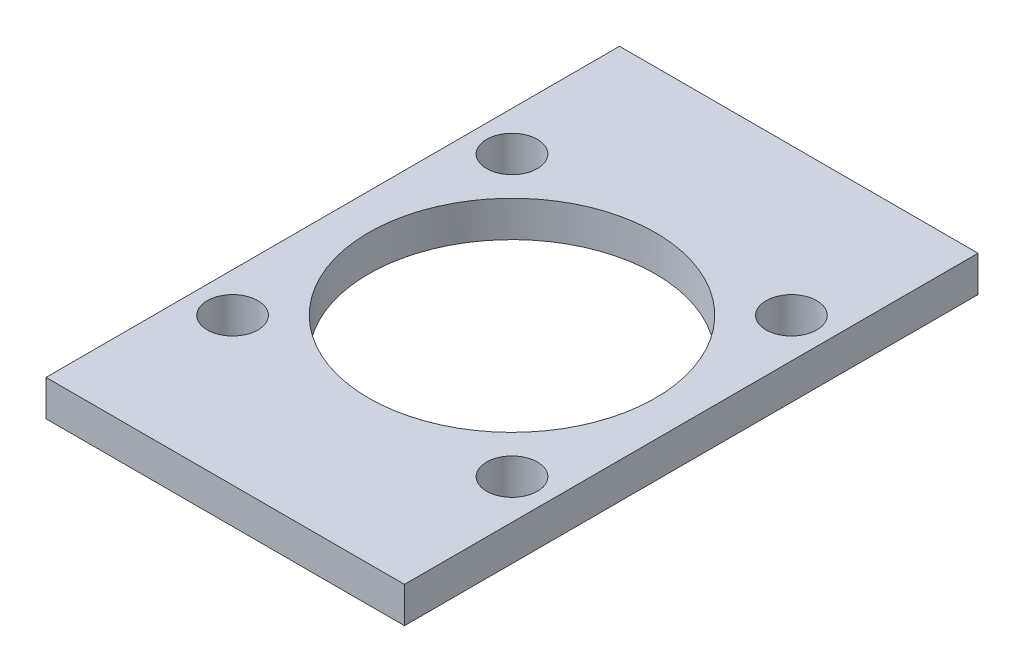
ISO-10303-21;
HEADER;
FILE_DESCRIPTION(('STEP AP214'),'2;1');
FILE_NAME('part.step','',(''),(''),'','','');
FILE_SCHEMA(('AUTOMOTIVE_DESIGN { 1 0 10303 214 1 1 1 1 }'));
ENDSEC;
DATA;
#1=APPLICATION_CONTEXT('core data for automotive mechanical design processes');
#2=APPLICATION_PROTOCOL_DEFINITION('international standard','automotive_design',2000,#1);
#3=PRODUCT_CONTEXT('',#1,'mechanical');
#4=PRODUCT('Part','Part','',(#3));
#5=PRODUCT_RELATED_PRODUCT_CATEGORY('part','',(#4));
#6=PRODUCT_DEFINITION_FORMATION('','',#4);
#7=PRODUCT_DEFINITION_CONTEXT('part definition',#1,'design');
#8=PRODUCT_DEFINITION('design','',#6,#7);
#9=PRODUCT_DEFINITION_SHAPE('','',#8);
#10=(LENGTH_UNIT() NAMED_UNIT(*) SI_UNIT(.MILLI.,.METRE.));
#11=(NAMED_UNIT(*) PLANE_ANGLE_UNIT() SI_UNIT($,.RADIAN.));
#12=(NAMED_UNIT(*) SI_UNIT($,.STERADIAN.) SOLID_ANGLE_UNIT());
#13=UNCERTAINTY_MEASURE_WITH_UNIT(LENGTH_MEASURE(1.E-05),#10,'distance_accuracy_value','');
#14=(GEOMETRIC_REPRESENTATION_CONTEXT(3) GLOBAL_UNCERTAINTY_ASSIGNED_CONTEXT((#13)) GLOBAL_UNIT_ASSIGNED_CONTEXT((#10,
#11,#12)) REPRESENTATION_CONTEXT('',''));
#15=CARTESIAN_POINT('',(0.,0.,0.));
#16=DIRECTION('',(0.,0.,1.));
#17=DIRECTION('',(1.,0.,0.));
#18=AXIS2_PLACEMENT_3D('',#15,#16,#17);
#19=CARTESIAN_POINT('',(15.875,3.175,25.4));
#20=DIRECTION('',(-1.,0.,0.));
#21=DIRECTION('',(0.,0.,1.));
#22=AXIS2_PLACEMENT_3D('',#19,#20,#21);
#23=PLANE('',#22);
#24=DIRECTION('',(0.,0.,-1.));
#25=VECTOR('',#24,1.);
#26=CARTESIAN_POINT('',(15.875,0.,25.4));
#27=LINE('',#26,#25);
#28=CARTESIAN_POINT('',(15.875,0.,25.4));
#29=VERTEX_POINT('',#28);
#30=CARTESIAN_POINT('',(15.875,0.,-25.4));
#31=VERTEX_POINT('',#30);
#32=EDGE_CURVE('E96',#29,#31,#27,.T.);
#33=ORIENTED_EDGE('',*,*,#32,.T.);
#34=DIRECTION('',(0.,-1.,0.));
#35=VECTOR('',#34,1.);
#36=CARTESIAN_POINT('',(15.875,3.175,-25.4));
#37=LINE('',#36,#35);
#38=CARTESIAN_POINT('',(15.875,3.175,-25.4));
#39=VERTEX_POINT('',#38);
#40=EDGE_CURVE('E11',#39,#31,#37,.T.);
#41=ORIENTED_EDGE('',*,*,#40,.F.);
#42=DIRECTION('',(0.,0.,-1.));
#43=VECTOR('',#42,1.);
#44=CARTESIAN_POINT('',(15.875,3.175,25.4));
#45=LINE('',#44,#43);
#46=CARTESIAN_POINT('',(15.875,3.175,25.4));
#47=VERTEX_POINT('',#46);
#48=EDGE_CURVE('E84',#47,#39,#45,.T.);
#49=ORIENTED_EDGE('',*,*,#48,.F.);
#50=DIRECTION('',(0.,-1.,0.));
#51=VECTOR('',#50,1.);
#52=CARTESIAN_POINT('',(15.875,3.175,25.4));
#53=LINE('',#52,#51);
#54=EDGE_CURVE('E92',#47,#29,#53,.T.);
#55=ORIENTED_EDGE('',*,*,#54,.T.);
#56=EDGE_LOOP('',(#33,#41,#49,#55));
#57=FACE_BOUND('',#56,.T.);
#58=ADVANCED_FACE('F33',(#57),#23,.F.);
#59=CARTESIAN_POINT('',(-15.875,3.175,-25.4));
#60=DIRECTION('',(0.,0.,1.));
#61=DIRECTION('',(1.,0.,0.));
#62=AXIS2_PLACEMENT_3D('',#59,#60,#61);
#63=PLANE('',#62);
#64=DIRECTION('',(-1.,0.,0.));
#65=VECTOR('',#64,1.);
#66=CARTESIAN_POINT('',(-15.875,0.,-25.4));
#67=LINE('',#66,#65);
#68=CARTESIAN_POINT('',(-15.875,0.,-25.4));
#69=VERTEX_POINT('',#68);
#70=EDGE_CURVE('E88',#31,#69,#67,.T.);
#71=ORIENTED_EDGE('',*,*,#70,.T.);
#72=DIRECTION('',(0.,-1.,0.));
#73=VECTOR('',#72,1.);
#74=CARTESIAN_POINT('',(-15.875,3.175,-25.4));
#75=LINE('',#74,#73);
#76=CARTESIAN_POINT('',(-15.875,3.175,-25.4));
#77=VERTEX_POINT('',#76);
#78=EDGE_CURVE('E41',#77,#69,#75,.T.);
#79=ORIENTED_EDGE('',*,*,#78,.F.);
#80=DIRECTION('',(-1.,0.,0.));
#81=VECTOR('',#80,1.);
#82=CARTESIAN_POINT('',(-15.875,3.175,-25.4));
#83=LINE('',#82,#81);
#84=EDGE_CURVE('E79',#39,#77,#83,.T.);
#85=ORIENTED_EDGE('',*,*,#84,.F.);
#86=ORIENTED_EDGE('',*,*,#40,.T.);
#87=EDGE_LOOP('',(#71,#79,#85,#86));
#88=FACE_BOUND('',#87,.T.);
#89=ADVANCED_FACE('F87',(#88),#63,.F.);
#90=CARTESIAN_POINT('',(-15.875,3.175,25.4));
#91=DIRECTION('',(1.,0.,0.));
#92=DIRECTION('',(0.,0.,-1.));
#93=AXIS2_PLACEMENT_3D('',#90,#91,#92);
#94=PLANE('',#93);
#95=DIRECTION('',(0.,0.,1.));
#96=VECTOR('',#95,1.);
#97=CARTESIAN_POINT('',(-15.875,0.,25.4));
#98=LINE('',#97,#96);
#99=CARTESIAN_POINT('',(-15.875,0.,25.4));
#100=VERTEX_POINT('',#99);
#101=EDGE_CURVE('E66',#69,#100,#98,.T.);
#102=ORIENTED_EDGE('',*,*,#101,.T.);
#103=DIRECTION('',(0.,-1.,0.));
#104=VECTOR('',#103,1.);
#105=CARTESIAN_POINT('',(-15.875,3.175,25.4));
#106=LINE('',#105,#104);
#107=CARTESIAN_POINT('',(-15.875,3.175,25.4));
#108=VERTEX_POINT('',#107);
#109=EDGE_CURVE('E89',#108,#100,#106,.T.);
#110=ORIENTED_EDGE('',*,*,#109,.F.);
#111=DIRECTION('',(0.,0.,1.));
#112=VECTOR('',#111,1.);
#113=CARTESIAN_POINT('',(-15.875,3.175,25.4));
#114=LINE('',#113,#112);
#115=EDGE_CURVE('E82',#77,#108,#114,.T.);
#116=ORIENTED_EDGE('',*,*,#115,.F.);
#117=ORIENTED_EDGE('',*,*,#78,.T.);
#118=EDGE_LOOP('',(#102,#110,#116,#117));
#119=FACE_BOUND('',#118,.T.);
#120=ADVANCED_FACE('F90',(#119),#94,.F.);
#121=CARTESIAN_POINT('',(-15.875,3.175,25.4));
#122=DIRECTION('',(0.,0.,-1.));
#123=DIRECTION('',(-1.,0.,0.));
#124=AXIS2_PLACEMENT_3D('',#121,#122,#123);
#125=PLANE('',#124);
#126=DIRECTION('',(1.,0.,0.));
#127=VECTOR('',#126,1.);
#128=CARTESIAN_POINT('',(-15.875,0.,25.4));
#129=LINE('',#128,#127);
#130=EDGE_CURVE('E72',#100,#29,#129,.T.);
#131=ORIENTED_EDGE('',*,*,#130,.T.);
#132=ORIENTED_EDGE('',*,*,#54,.F.);
#133=DIRECTION('',(1.,0.,0.));
#134=VECTOR('',#133,1.);
#135=CARTESIAN_POINT('',(-15.875,3.175,25.4));
#136=LINE('',#135,#134);
#137=EDGE_CURVE('E49',#108,#47,#136,.T.);
#138=ORIENTED_EDGE('',*,*,#137,.F.);
#139=ORIENTED_EDGE('',*,*,#109,.T.);
#140=EDGE_LOOP('',(#131,#132,#138,#139));
#141=FACE_BOUND('',#140,.T.);
#142=ADVANCED_FACE('F104',(#141),#125,.F.);
#143=CARTESIAN_POINT('',(0.,3.175,0.));
#144=DIRECTION('',(0.,-1.,0.));
#145=DIRECTION('',(0.,0.,-1.));
#146=AXIS2_PLACEMENT_3D('',#143,#144,#145);
#147=PLANE('',#146);
#148=CARTESIAN_POINT('',(12.3747929348333,3.175,12.3747929348333));
#149=DIRECTION('',(0.,1.,0.));
#150=DIRECTION('',(0.,0.,1.));
#151=AXIS2_PLACEMENT_3D('',#148,#149,#150);
#152=CIRCLE('',#151,2.2479);
#153=CARTESIAN_POINT('',(12.3747929348333,3.175,14.6226929348333));
#154=VERTEX_POINT('',#153);
#155=EDGE_CURVE('E136',#154,#154,#152,.T.);
#156=ORIENTED_EDGE('',*,*,#155,.F.);
#157=EDGE_LOOP('',(#156));
#158=FACE_BOUND('',#157,.T.);
#159=CARTESIAN_POINT('',(-12.3747929348333,3.175,12.3747929348333));
#160=DIRECTION('',(0.,1.,0.));
#161=DIRECTION('',(0.,0.,1.));
#162=AXIS2_PLACEMENT_3D('',#159,#160,#161);
#163=CIRCLE('',#162,2.2479);
#164=CARTESIAN_POINT('',(-12.3747929348333,3.175,14.6226929348333));
#165=VERTEX_POINT('',#164);
#166=EDGE_CURVE('E130',#165,#165,#163,.T.);
#167=ORIENTED_EDGE('',*,*,#166,.F.);
#168=EDGE_LOOP('',(#167));
#169=FACE_BOUND('',#168,.T.);
#170=CARTESIAN_POINT('',(-12.3747929348333,3.175,-12.3747929348333));
#171=DIRECTION('',(0.,1.,0.));
#172=DIRECTION('',(0.,0.,1.));
#173=AXIS2_PLACEMENT_3D('',#170,#171,#172);
#174=CIRCLE('',#173,2.2479);
#175=CARTESIAN_POINT('',(-12.3747929348333,3.175,-10.1268929348333));
#176=VERTEX_POINT('',#175);
#177=EDGE_CURVE('E124',#176,#176,#174,.T.);
#178=ORIENTED_EDGE('',*,*,#177,.F.);
#179=EDGE_LOOP('',(#178));
#180=FACE_BOUND('',#179,.T.);
#181=CARTESIAN_POINT('',(12.3747929348333,3.175,-12.3747929348333));
#182=DIRECTION('',(0.,1.,0.));
#183=DIRECTION('',(0.,0.,1.));
#184=AXIS2_PLACEMENT_3D('',#181,#182,#183);
#185=CIRCLE('',#184,2.2479);
#186=CARTESIAN_POINT('',(12.3747929348333,3.175,-10.1268929348333));
#187=VERTEX_POINT('',#186);
#188=EDGE_CURVE('E118',#187,#187,#185,.T.);
#189=ORIENTED_EDGE('',*,*,#188,.F.);
#190=EDGE_LOOP('',(#189));
#191=FACE_BOUND('',#190,.T.);
#192=CARTESIAN_POINT('',(0.,3.175,0.));
#193=DIRECTION('',(0.,1.,0.));
#194=DIRECTION('',(0.,0.,1.));
#195=AXIS2_PLACEMENT_3D('',#192,#193,#194);
#196=CIRCLE('',#195,12.7);
#197=CARTESIAN_POINT('',(0.,3.175,12.7));
#198=VERTEX_POINT('',#197);
#199=EDGE_CURVE('E99',#198,#198,#196,.T.);
#200=ORIENTED_EDGE('',*,*,#199,.F.);
#201=EDGE_LOOP('',(#200));
#202=FACE_BOUND('',#201,.T.);
#203=ORIENTED_EDGE('',*,*,#48,.T.);
#204=ORIENTED_EDGE('',*,*,#84,.T.);
#205=ORIENTED_EDGE('',*,*,#115,.T.);
#206=ORIENTED_EDGE('',*,*,#137,.T.);
#207=EDGE_LOOP('',(#203,#204,#205,#206));
#208=FACE_BOUND('',#207,.T.);
#209=ADVANCED_FACE('F80',(#158,#169,#180,#191,#202,#208),#147,.F.);
#210=CARTESIAN_POINT('',(0.,0.,0.));
#211=DIRECTION('',(0.,-1.,0.));
#212=DIRECTION('',(0.,0.,-1.));
#213=AXIS2_PLACEMENT_3D('',#210,#211,#212);
#214=PLANE('',#213);
#215=CARTESIAN_POINT('',(12.3747929348333,0.,12.3747929348333));
#216=DIRECTION('',(0.,-1.,0.));
#217=DIRECTION('',(0.,0.,-1.));
#218=AXIS2_PLACEMENT_3D('',#215,#216,#217);
#219=CIRCLE('',#218,2.2479);
#220=CARTESIAN_POINT('',(12.3747929348333,0.,10.1268929348333));
#221=VERTEX_POINT('',#220);
#222=EDGE_CURVE('E133',#221,#221,#219,.T.);
#223=ORIENTED_EDGE('',*,*,#222,.F.);
#224=EDGE_LOOP('',(#223));
#225=FACE_BOUND('',#224,.T.);
#226=CARTESIAN_POINT('',(-12.3747929348333,0.,12.3747929348333));
#227=DIRECTION('',(0.,-1.,0.));
#228=DIRECTION('',(0.,0.,-1.));
#229=AXIS2_PLACEMENT_3D('',#226,#227,#228);
#230=CIRCLE('',#229,2.2479);
#231=CARTESIAN_POINT('',(-12.3747929348333,0.,10.1268929348333));
#232=VERTEX_POINT('',#231);
#233=EDGE_CURVE('E127',#232,#232,#230,.T.);
#234=ORIENTED_EDGE('',*,*,#233,.F.);
#235=EDGE_LOOP('',(#234));
#236=FACE_BOUND('',#235,.T.);
#237=CARTESIAN_POINT('',(-12.3747929348333,0.,-12.3747929348333));
#238=DIRECTION('',(0.,-1.,0.));
#239=DIRECTION('',(0.,0.,-1.));
#240=AXIS2_PLACEMENT_3D('',#237,#238,#239);
#241=CIRCLE('',#240,2.2479);
#242=CARTESIAN_POINT('',(-12.3747929348333,0.,-14.6226929348333));
#243=VERTEX_POINT('',#242);
#244=EDGE_CURVE('E121',#243,#243,#241,.T.);
#245=ORIENTED_EDGE('',*,*,#244,.F.);
#246=EDGE_LOOP('',(#245));
#247=FACE_BOUND('',#246,.T.);
#248=CARTESIAN_POINT('',(12.3747929348333,0.,-12.3747929348333));
#249=DIRECTION('',(0.,-1.,0.));
#250=DIRECTION('',(0.,0.,-1.));
#251=AXIS2_PLACEMENT_3D('',#248,#249,#250);
#252=CIRCLE('',#251,2.2479);
#253=CARTESIAN_POINT('',(12.3747929348333,0.,-14.6226929348333));
#254=VERTEX_POINT('',#253);
#255=EDGE_CURVE('E113',#254,#254,#252,.T.);
#256=ORIENTED_EDGE('',*,*,#255,.F.);
#257=EDGE_LOOP('',(#256));
#258=FACE_BOUND('',#257,.T.);
#259=CARTESIAN_POINT('',(0.,0.,0.));
#260=DIRECTION('',(0.,-1.,0.));
#261=DIRECTION('',(0.,0.,-1.));
#262=AXIS2_PLACEMENT_3D('',#259,#260,#261);
#263=CIRCLE('',#262,12.7);
#264=CARTESIAN_POINT('',(0.,0.,-12.7));
#265=VERTEX_POINT('',#264);
#266=EDGE_CURVE('E110',#265,#265,#263,.F.);
#267=ORIENTED_EDGE('',*,*,#266,.T.);
#268=EDGE_LOOP('',(#267));
#269=FACE_BOUND('',#268,.T.);
#270=ORIENTED_EDGE('',*,*,#32,.F.);
#271=ORIENTED_EDGE('',*,*,#130,.F.);
#272=ORIENTED_EDGE('',*,*,#101,.F.);
#273=ORIENTED_EDGE('',*,*,#70,.F.);
#274=EDGE_LOOP('',(#270,#271,#272,#273));
#275=FACE_BOUND('',#274,.T.);
#276=ADVANCED_FACE('F107',(#225,#236,#247,#258,#269,#275),#214,.T.);
#277=CARTESIAN_POINT('',(0.,-0.00100000000000013,0.));
#278=DIRECTION('',(0.,1.,0.));
#279=DIRECTION('',(0.,0.,1.));
#280=AXIS2_PLACEMENT_3D('',#277,#278,#279);
#281=CYLINDRICAL_SURFACE('',#280,12.7);
#282=ORIENTED_EDGE('',*,*,#266,.F.);
#283=EDGE_LOOP('',(#282));
#284=FACE_BOUND('',#283,.T.);
#285=ORIENTED_EDGE('',*,*,#199,.T.);
#286=EDGE_LOOP('',(#285));
#287=FACE_BOUND('',#286,.T.);
#288=ADVANCED_FACE('F154',(#284,#287),#281,.F.);
#289=CARTESIAN_POINT('',(12.3747929348333,3.175,-12.3747929348333));
#290=DIRECTION('',(0.,1.,0.));
#291=DIRECTION('',(0.,0.,1.));
#292=AXIS2_PLACEMENT_3D('',#289,#290,#291);
#293=CYLINDRICAL_SURFACE('',#292,2.2479);
#294=ORIENTED_EDGE('',*,*,#188,.T.);
#295=EDGE_LOOP('',(#294));
#296=FACE_BOUND('',#295,.T.);
#297=ORIENTED_EDGE('',*,*,#255,.T.);
#298=EDGE_LOOP('',(#297));
#299=FACE_BOUND('',#298,.T.);
#300=ADVANCED_FACE('F156',(#296,#299),#293,.F.);
#301=CARTESIAN_POINT('',(-12.3747929348333,3.175,-12.3747929348333));
#302=DIRECTION('',(0.,1.,0.));
#303=DIRECTION('',(0.,0.,1.));
#304=AXIS2_PLACEMENT_3D('',#301,#302,#303);
#305=CYLINDRICAL_SURFACE('',#304,2.2479);
#306=ORIENTED_EDGE('',*,*,#177,.T.);
#307=EDGE_LOOP('',(#306));
#308=FACE_BOUND('',#307,.T.);
#309=ORIENTED_EDGE('',*,*,#244,.T.);
#310=EDGE_LOOP('',(#309));
#311=FACE_BOUND('',#310,.T.);
#312=ADVANCED_FACE('F163',(#308,#311),#305,.F.);
#313=CARTESIAN_POINT('',(-12.3747929348333,3.175,12.3747929348333));
#314=DIRECTION('',(0.,1.,0.));
#315=DIRECTION('',(0.,0.,1.));
#316=AXIS2_PLACEMENT_3D('',#313,#314,#315);
#317=CYLINDRICAL_SURFACE('',#316,2.2479);
#318=ORIENTED_EDGE('',*,*,#166,.T.);
#319=EDGE_LOOP('',(#318));
#320=FACE_BOUND('',#319,.T.);
#321=ORIENTED_EDGE('',*,*,#233,.T.);
#322=EDGE_LOOP('',(#321));
#323=FACE_BOUND('',#322,.T.);
#324=ADVANCED_FACE('F207',(#320,#323),#317,.F.);
#325=CARTESIAN_POINT('',(12.3747929348333,3.175,12.3747929348333));
#326=DIRECTION('',(0.,1.,0.));
#327=DIRECTION('',(0.,0.,1.));
#328=AXIS2_PLACEMENT_3D('',#325,#326,#327);
#329=CYLINDRICAL_SURFACE('',#328,2.2479);
#330=ORIENTED_EDGE('',*,*,#155,.T.);
#331=EDGE_LOOP('',(#330));
#332=FACE_BOUND('',#331,.T.);
#333=ORIENTED_EDGE('',*,*,#222,.T.);
#334=EDGE_LOOP('',(#333));
#335=FACE_BOUND('',#334,.T.);
#336=ADVANCED_FACE('F140',(#332,#335),#329,.F.);
#337=CLOSED_SHELL('',(#58,#89,#120,#142,#209,#276,#288,#300,#312,#324,#336));
#338=MANIFOLD_SOLID_BREP('B2',#337);
#339=ADVANCED_BREP_SHAPE_REPRESENTATION('',(#18,#338),#14);
#340=SHAPE_DEFINITION_REPRESENTATION(#9,#339);
ENDSEC;
END-ISO-10303-21;
